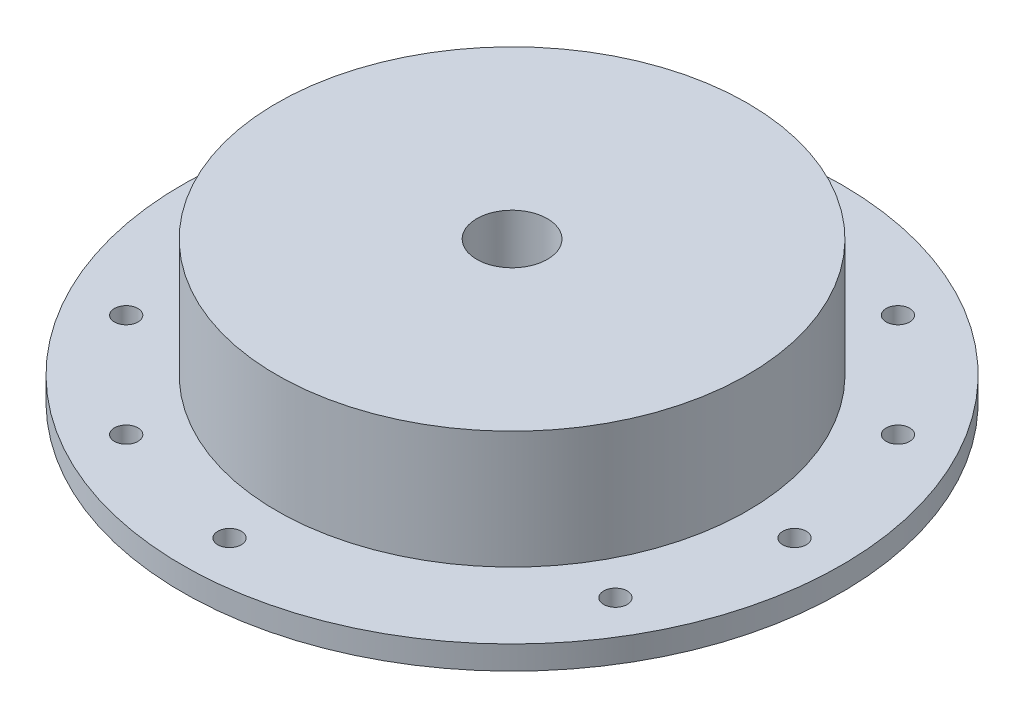
ISO-10303-21;
HEADER;
FILE_DESCRIPTION(('STEP AP214'),'2;1');
FILE_NAME('part.step','',(''),(''),'','','');
FILE_SCHEMA(('AUTOMOTIVE_DESIGN { 1 0 10303 214 1 1 1 1 }'));
ENDSEC;
DATA;
#1=APPLICATION_CONTEXT('core data for automotive mechanical design processes');
#2=APPLICATION_PROTOCOL_DEFINITION('international standard','automotive_design',2000,#1);
#3=PRODUCT_CONTEXT('',#1,'mechanical');
#4=PRODUCT('Part','Part','',(#3));
#5=PRODUCT_RELATED_PRODUCT_CATEGORY('part','',(#4));
#6=PRODUCT_DEFINITION_FORMATION('','',#4);
#7=PRODUCT_DEFINITION_CONTEXT('part definition',#1,'design');
#8=PRODUCT_DEFINITION('design','',#6,#7);
#9=PRODUCT_DEFINITION_SHAPE('','',#8);
#10=(LENGTH_UNIT() NAMED_UNIT(*) SI_UNIT(.MILLI.,.METRE.));
#11=(NAMED_UNIT(*) PLANE_ANGLE_UNIT() SI_UNIT($,.RADIAN.));
#12=(NAMED_UNIT(*) SI_UNIT($,.STERADIAN.) SOLID_ANGLE_UNIT());
#13=UNCERTAINTY_MEASURE_WITH_UNIT(LENGTH_MEASURE(1.E-05),#10,'distance_accuracy_value','');
#14=(GEOMETRIC_REPRESENTATION_CONTEXT(3) GLOBAL_UNCERTAINTY_ASSIGNED_CONTEXT((#13)) GLOBAL_UNIT_ASSIGNED_CONTEXT((#10,
#11,#12)) REPRESENTATION_CONTEXT('',''));
#15=CARTESIAN_POINT('',(0.,0.,0.));
#16=DIRECTION('',(0.,0.,1.));
#17=DIRECTION('',(1.,0.,0.));
#18=AXIS2_PLACEMENT_3D('',#15,#16,#17);
#19=CARTESIAN_POINT('',(63.5,38.1,0.));
#20=DIRECTION('',(0.,1.,0.));
#21=DIRECTION('',(0.,0.,1.));
#22=AXIS2_PLACEMENT_3D('',#19,#20,#21);
#23=PLANE('',#22);
#24=CARTESIAN_POINT('',(0.,38.1,0.));
#25=DIRECTION('',(0.,-1.,0.));
#26=DIRECTION('',(0.,0.,-1.));
#27=AXIS2_PLACEMENT_3D('',#24,#25,#26);
#28=CIRCLE('',#27,9.525);
#29=CARTESIAN_POINT('',(0.,38.1,-9.525));
#30=VERTEX_POINT('',#29);
#31=EDGE_CURVE('E10',#30,#30,#28,.T.);
#32=ORIENTED_EDGE('',*,*,#31,.T.);
#33=EDGE_LOOP('',(#32));
#34=FACE_BOUND('',#33,.T.);
#35=CARTESIAN_POINT('',(0.,38.1,0.));
#36=DIRECTION('',(0.,-1.,0.));
#37=DIRECTION('',(0.,0.,-1.));
#38=AXIS2_PLACEMENT_3D('',#35,#36,#37);
#39=CIRCLE('',#38,63.5);
#40=CARTESIAN_POINT('',(0.,38.1,-63.5));
#41=VERTEX_POINT('',#40);
#42=EDGE_CURVE('E58',#41,#41,#39,.T.);
#43=ORIENTED_EDGE('',*,*,#42,.F.);
#44=EDGE_LOOP('',(#43));
#45=FACE_BOUND('',#44,.T.);
#46=ADVANCED_FACE('F33',(#34,#45),#23,.T.);
#47=CARTESIAN_POINT('',(0.,0.,0.));
#48=DIRECTION('',(0.,-1.,0.));
#49=DIRECTION('',(0.,0.,-1.));
#50=AXIS2_PLACEMENT_3D('',#47,#48,#49);
#51=CYLINDRICAL_SURFACE('',#50,9.525);
#52=CARTESIAN_POINT('',(0.,11.1125,0.));
#53=DIRECTION('',(0.,-1.,0.));
#54=DIRECTION('',(0.,0.,-1.));
#55=AXIS2_PLACEMENT_3D('',#52,#53,#54);
#56=CIRCLE('',#55,9.525);
#57=CARTESIAN_POINT('',(0.,11.1125,-9.525));
#58=VERTEX_POINT('',#57);
#59=EDGE_CURVE('E39',#58,#58,#56,.T.);
#60=ORIENTED_EDGE('',*,*,#59,.T.);
#61=EDGE_LOOP('',(#60));
#62=FACE_BOUND('',#61,.T.);
#63=ORIENTED_EDGE('',*,*,#31,.F.);
#64=EDGE_LOOP('',(#63));
#65=FACE_BOUND('',#64,.T.);
#66=ADVANCED_FACE('F175',(#62,#65),#51,.F.);
#67=CARTESIAN_POINT('',(0.,42.2955357142857,0.));
#68=DIRECTION('',(0.,-1.,0.));
#69=DIRECTION('',(0.,0.,-1.));
#70=AXIS2_PLACEMENT_3D('',#67,#68,#69);
#71=DEGENERATE_TOROIDAL_SURFACE('',#70,38.1,42.2955357142857,.T.);
#72=CARTESIAN_POINT('',(0.,0.,0.));
#73=DIRECTION('',(0.,-1.,0.));
#74=DIRECTION('',(0.,0.,-1.));
#75=AXIS2_PLACEMENT_3D('',#72,#73,#74);
#76=CIRCLE('',#75,38.1);
#77=CARTESIAN_POINT('',(0.,0.,-38.1));
#78=VERTEX_POINT('',#77);
#79=EDGE_CURVE('E43',#78,#78,#76,.T.);
#80=ORIENTED_EDGE('',*,*,#79,.T.);
#81=EDGE_LOOP('',(#80));
#82=FACE_BOUND('',#81,.T.);
#83=ORIENTED_EDGE('',*,*,#59,.F.);
#84=EDGE_LOOP('',(#83));
#85=FACE_BOUND('',#84,.T.);
#86=ADVANCED_FACE('F168',(#82,#85),#71,.T.);
#87=CARTESIAN_POINT('',(38.1,0.,0.));
#88=DIRECTION('',(0.,-1.,0.));
#89=DIRECTION('',(0.,0.,-1.));
#90=AXIS2_PLACEMENT_3D('',#87,#88,#89);
#91=PLANE('',#90);
#92=CARTESIAN_POINT('',(-38.0999999999991,0.,65.9911357683747));
#93=DIRECTION('',(0.,1.,0.));
#94=DIRECTION('',(0.,0.,1.));
#95=AXIS2_PLACEMENT_3D('',#92,#93,#94);
#96=CIRCLE('',#95,3.175);
#97=CARTESIAN_POINT('',(-38.0999999999991,0.,69.1661357683747));
#98=VERTEX_POINT('',#97);
#99=EDGE_CURVE('E121',#98,#98,#96,.T.);
#100=ORIENTED_EDGE('',*,*,#99,.T.);
#101=EDGE_LOOP('',(#100));
#102=FACE_BOUND('',#101,.T.);
#103=CARTESIAN_POINT('',(-65.9911357683738,0.,38.1000000000008));
#104=DIRECTION('',(0.,1.,0.));
#105=DIRECTION('',(0.,0.,1.));
#106=AXIS2_PLACEMENT_3D('',#103,#104,#105);
#107=CIRCLE('',#106,3.175);
#108=CARTESIAN_POINT('',(-65.9911357683738,0.,41.2750000000008));
#109=VERTEX_POINT('',#108);
#110=EDGE_CURVE('E115',#109,#109,#107,.T.);
#111=ORIENTED_EDGE('',*,*,#110,.T.);
#112=EDGE_LOOP('',(#111));
#113=FACE_BOUND('',#112,.T.);
#114=CARTESIAN_POINT('',(-76.2,0.,8.08560974915401E-13));
#115=DIRECTION('',(0.,1.,0.));
#116=DIRECTION('',(0.,0.,1.));
#117=AXIS2_PLACEMENT_3D('',#114,#115,#116);
#118=CIRCLE('',#117,3.175);
#119=CARTESIAN_POINT('',(-76.2,0.,3.17500000000081));
#120=VERTEX_POINT('',#119);
#121=EDGE_CURVE('E109',#120,#120,#118,.T.);
#122=ORIENTED_EDGE('',*,*,#121,.T.);
#123=EDGE_LOOP('',(#122));
#124=FACE_BOUND('',#123,.T.);
#125=CARTESIAN_POINT('',(-65.9911357683746,0.,-38.0999999999994));
#126=DIRECTION('',(0.,1.,0.));
#127=DIRECTION('',(0.,0.,1.));
#128=AXIS2_PLACEMENT_3D('',#125,#126,#127);
#129=CIRCLE('',#128,3.175);
#130=CARTESIAN_POINT('',(-65.9911357683746,0.,-34.9249999999994));
#131=VERTEX_POINT('',#130);
#132=EDGE_CURVE('E103',#131,#131,#129,.T.);
#133=ORIENTED_EDGE('',*,*,#132,.T.);
#134=EDGE_LOOP('',(#133));
#135=FACE_BOUND('',#134,.T.);
#136=CARTESIAN_POINT('',(-38.1000000000005,0.,-65.9911357683739));
#137=DIRECTION('',(0.,1.,0.));
#138=DIRECTION('',(0.,0.,1.));
#139=AXIS2_PLACEMENT_3D('',#136,#137,#138);
#140=CIRCLE('',#139,3.175);
#141=CARTESIAN_POINT('',(-38.1000000000005,0.,-62.8161357683739));
#142=VERTEX_POINT('',#141);
#143=EDGE_CURVE('E97',#142,#142,#140,.T.);
#144=ORIENTED_EDGE('',*,*,#143,.T.);
#145=EDGE_LOOP('',(#144));
#146=FACE_BOUND('',#145,.T.);
#147=CARTESIAN_POINT('',(0.,0.,-76.2));
#148=DIRECTION('',(0.,1.,0.));
#149=DIRECTION('',(0.,0.,1.));
#150=AXIS2_PLACEMENT_3D('',#147,#148,#149);
#151=CIRCLE('',#150,3.175);
#152=CARTESIAN_POINT('',(0.,0.,-73.025));
#153=VERTEX_POINT('',#152);
#154=EDGE_CURVE('E91',#153,#153,#151,.T.);
#155=ORIENTED_EDGE('',*,*,#154,.T.);
#156=EDGE_LOOP('',(#155));
#157=FACE_BOUND('',#156,.T.);
#158=CARTESIAN_POINT('',(38.0999999999996,0.,-65.9911357683744));
#159=DIRECTION('',(0.,1.,0.));
#160=DIRECTION('',(0.,0.,1.));
#161=AXIS2_PLACEMENT_3D('',#158,#159,#160);
#162=CIRCLE('',#161,3.175);
#163=CARTESIAN_POINT('',(38.0999999999996,0.,-62.8161357683745));
#164=VERTEX_POINT('',#163);
#165=EDGE_CURVE('E85',#164,#164,#162,.T.);
#166=ORIENTED_EDGE('',*,*,#165,.T.);
#167=EDGE_LOOP('',(#166));
#168=FACE_BOUND('',#167,.T.);
#169=CARTESIAN_POINT('',(65.9911357683741,0.,-38.1000000000003));
#170=DIRECTION('',(0.,1.,0.));
#171=DIRECTION('',(0.,0.,1.));
#172=AXIS2_PLACEMENT_3D('',#169,#170,#171);
#173=CIRCLE('',#172,3.175);
#174=CARTESIAN_POINT('',(65.9911357683741,0.,-34.9250000000003));
#175=VERTEX_POINT('',#174);
#176=EDGE_CURVE('E79',#175,#175,#173,.T.);
#177=ORIENTED_EDGE('',*,*,#176,.T.);
#178=EDGE_LOOP('',(#177));
#179=FACE_BOUND('',#178,.T.);
#180=CARTESIAN_POINT('',(76.2,0.,-2.76459218875708E-13));
#181=DIRECTION('',(0.,1.,0.));
#182=DIRECTION('',(0.,0.,1.));
#183=AXIS2_PLACEMENT_3D('',#180,#181,#182);
#184=CIRCLE('',#183,3.175);
#185=CARTESIAN_POINT('',(76.2,0.,3.17499999999972));
#186=VERTEX_POINT('',#185);
#187=EDGE_CURVE('E73',#186,#186,#184,.T.);
#188=ORIENTED_EDGE('',*,*,#187,.T.);
#189=EDGE_LOOP('',(#188));
#190=FACE_BOUND('',#189,.T.);
#191=CARTESIAN_POINT('',(65.9911357683743,0.,38.0999999999998));
#192=DIRECTION('',(0.,1.,0.));
#193=DIRECTION('',(0.,0.,1.));
#194=AXIS2_PLACEMENT_3D('',#191,#192,#193);
#195=CIRCLE('',#194,3.175);
#196=CARTESIAN_POINT('',(65.9911357683743,0.,41.2749999999998));
#197=VERTEX_POINT('',#196);
#198=EDGE_CURVE('E67',#197,#197,#195,.T.);
#199=ORIENTED_EDGE('',*,*,#198,.T.);
#200=EDGE_LOOP('',(#199));
#201=FACE_BOUND('',#200,.T.);
#202=CARTESIAN_POINT('',(0.,0.,76.2));
#203=DIRECTION('',(0.,1.,0.));
#204=DIRECTION('',(0.,0.,1.));
#205=AXIS2_PLACEMENT_3D('',#202,#203,#204);
#206=CIRCLE('',#205,3.175);
#207=CARTESIAN_POINT('',(0.,0.,79.375));
#208=VERTEX_POINT('',#207);
#209=EDGE_CURVE('E61',#208,#208,#206,.T.);
#210=ORIENTED_EDGE('',*,*,#209,.T.);
#211=EDGE_LOOP('',(#210));
#212=FACE_BOUND('',#211,.T.);
#213=CARTESIAN_POINT('',(0.,0.,0.));
#214=DIRECTION('',(0.,-1.,0.));
#215=DIRECTION('',(0.,0.,-1.));
#216=AXIS2_PLACEMENT_3D('',#213,#214,#215);
#217=CIRCLE('',#216,88.9);
#218=CARTESIAN_POINT('',(0.,0.,-88.9));
#219=VERTEX_POINT('',#218);
#220=EDGE_CURVE('E47',#219,#219,#217,.T.);
#221=ORIENTED_EDGE('',*,*,#220,.T.);
#222=EDGE_LOOP('',(#221));
#223=FACE_BOUND('',#222,.T.);
#224=ORIENTED_EDGE('',*,*,#79,.F.);
#225=EDGE_LOOP('',(#224));
#226=FACE_BOUND('',#225,.T.);
#227=ADVANCED_FACE('F162',(#102,#113,#124,#135,#146,#157,#168,#179,#190,#201,#212,#223,#226),
#91,.T.);
#228=CARTESIAN_POINT('',(0.,0.,0.));
#229=DIRECTION('',(0.,-1.,0.));
#230=DIRECTION('',(0.,0.,-1.));
#231=AXIS2_PLACEMENT_3D('',#228,#229,#230);
#232=CYLINDRICAL_SURFACE('',#231,88.9);
#233=CARTESIAN_POINT('',(0.,6.35,0.));
#234=DIRECTION('',(0.,-1.,0.));
#235=DIRECTION('',(0.,0.,-1.));
#236=AXIS2_PLACEMENT_3D('',#233,#234,#235);
#237=CIRCLE('',#236,88.9);
#238=CARTESIAN_POINT('',(0.,6.35,-88.9));
#239=VERTEX_POINT('',#238);
#240=EDGE_CURVE('E52',#239,#239,#237,.T.);
#241=ORIENTED_EDGE('',*,*,#240,.T.);
#242=EDGE_LOOP('',(#241));
#243=FACE_BOUND('',#242,.T.);
#244=ORIENTED_EDGE('',*,*,#220,.F.);
#245=EDGE_LOOP('',(#244));
#246=FACE_BOUND('',#245,.T.);
#247=ADVANCED_FACE('F134',(#243,#246),#232,.T.);
#248=CARTESIAN_POINT('',(88.9,6.34999999999999,0.));
#249=DIRECTION('',(0.,1.,0.));
#250=DIRECTION('',(0.,0.,1.));
#251=AXIS2_PLACEMENT_3D('',#248,#249,#250);
#252=PLANE('',#251);
#253=CARTESIAN_POINT('',(-38.0999999999991,6.34999999999999,65.9911357683747));
#254=DIRECTION('',(0.,1.,0.));
#255=DIRECTION('',(0.,0.,1.));
#256=AXIS2_PLACEMENT_3D('',#253,#254,#255);
#257=CIRCLE('',#256,3.175);
#258=CARTESIAN_POINT('',(-38.0999999999991,6.34999999999999,69.1661357683747));
#259=VERTEX_POINT('',#258);
#260=EDGE_CURVE('E124',#259,#259,#257,.T.);
#261=ORIENTED_EDGE('',*,*,#260,.F.);
#262=EDGE_LOOP('',(#261));
#263=FACE_BOUND('',#262,.T.);
#264=CARTESIAN_POINT('',(-65.9911357683738,6.34999999999999,38.1000000000008));
#265=DIRECTION('',(0.,1.,0.));
#266=DIRECTION('',(0.,0.,1.));
#267=AXIS2_PLACEMENT_3D('',#264,#265,#266);
#268=CIRCLE('',#267,3.175);
#269=CARTESIAN_POINT('',(-65.9911357683738,6.34999999999999,41.2750000000008));
#270=VERTEX_POINT('',#269);
#271=EDGE_CURVE('E118',#270,#270,#268,.T.);
#272=ORIENTED_EDGE('',*,*,#271,.F.);
#273=EDGE_LOOP('',(#272));
#274=FACE_BOUND('',#273,.T.);
#275=CARTESIAN_POINT('',(-76.2,6.34999999999999,8.08560974915401E-13));
#276=DIRECTION('',(0.,1.,0.));
#277=DIRECTION('',(0.,0.,1.));
#278=AXIS2_PLACEMENT_3D('',#275,#276,#277);
#279=CIRCLE('',#278,3.175);
#280=CARTESIAN_POINT('',(-76.2,6.34999999999999,3.17500000000081));
#281=VERTEX_POINT('',#280);
#282=EDGE_CURVE('E112',#281,#281,#279,.T.);
#283=ORIENTED_EDGE('',*,*,#282,.F.);
#284=EDGE_LOOP('',(#283));
#285=FACE_BOUND('',#284,.T.);
#286=CARTESIAN_POINT('',(-65.9911357683746,6.34999999999999,-38.0999999999994));
#287=DIRECTION('',(0.,1.,0.));
#288=DIRECTION('',(0.,0.,1.));
#289=AXIS2_PLACEMENT_3D('',#286,#287,#288);
#290=CIRCLE('',#289,3.175);
#291=CARTESIAN_POINT('',(-65.9911357683746,6.34999999999999,-34.9249999999994));
#292=VERTEX_POINT('',#291);
#293=EDGE_CURVE('E106',#292,#292,#290,.T.);
#294=ORIENTED_EDGE('',*,*,#293,.F.);
#295=EDGE_LOOP('',(#294));
#296=FACE_BOUND('',#295,.T.);
#297=CARTESIAN_POINT('',(-38.1000000000005,6.34999999999999,-65.9911357683739));
#298=DIRECTION('',(0.,1.,0.));
#299=DIRECTION('',(0.,0.,1.));
#300=AXIS2_PLACEMENT_3D('',#297,#298,#299);
#301=CIRCLE('',#300,3.175);
#302=CARTESIAN_POINT('',(-38.1000000000005,6.34999999999999,-62.8161357683739));
#303=VERTEX_POINT('',#302);
#304=EDGE_CURVE('E100',#303,#303,#301,.T.);
#305=ORIENTED_EDGE('',*,*,#304,.F.);
#306=EDGE_LOOP('',(#305));
#307=FACE_BOUND('',#306,.T.);
#308=CARTESIAN_POINT('',(0.,6.34999999999999,-76.2));
#309=DIRECTION('',(0.,1.,0.));
#310=DIRECTION('',(0.,0.,1.));
#311=AXIS2_PLACEMENT_3D('',#308,#309,#310);
#312=CIRCLE('',#311,3.175);
#313=CARTESIAN_POINT('',(0.,6.34999999999999,-73.025));
#314=VERTEX_POINT('',#313);
#315=EDGE_CURVE('E94',#314,#314,#312,.T.);
#316=ORIENTED_EDGE('',*,*,#315,.F.);
#317=EDGE_LOOP('',(#316));
#318=FACE_BOUND('',#317,.T.);
#319=CARTESIAN_POINT('',(38.0999999999996,6.34999999999999,-65.9911357683744));
#320=DIRECTION('',(0.,1.,0.));
#321=DIRECTION('',(0.,0.,1.));
#322=AXIS2_PLACEMENT_3D('',#319,#320,#321);
#323=CIRCLE('',#322,3.175);
#324=CARTESIAN_POINT('',(38.0999999999996,6.34999999999999,-62.8161357683745));
#325=VERTEX_POINT('',#324);
#326=EDGE_CURVE('E88',#325,#325,#323,.T.);
#327=ORIENTED_EDGE('',*,*,#326,.F.);
#328=EDGE_LOOP('',(#327));
#329=FACE_BOUND('',#328,.T.);
#330=CARTESIAN_POINT('',(65.9911357683741,6.34999999999999,-38.1000000000003));
#331=DIRECTION('',(0.,1.,0.));
#332=DIRECTION('',(0.,0.,1.));
#333=AXIS2_PLACEMENT_3D('',#330,#331,#332);
#334=CIRCLE('',#333,3.175);
#335=CARTESIAN_POINT('',(65.9911357683741,6.34999999999999,-34.9250000000003));
#336=VERTEX_POINT('',#335);
#337=EDGE_CURVE('E82',#336,#336,#334,.T.);
#338=ORIENTED_EDGE('',*,*,#337,.F.);
#339=EDGE_LOOP('',(#338));
#340=FACE_BOUND('',#339,.T.);
#341=CARTESIAN_POINT('',(76.2,6.34999999999999,-2.76459218875708E-13));
#342=DIRECTION('',(0.,1.,0.));
#343=DIRECTION('',(0.,0.,1.));
#344=AXIS2_PLACEMENT_3D('',#341,#342,#343);
#345=CIRCLE('',#344,3.175);
#346=CARTESIAN_POINT('',(76.2,6.34999999999999,3.17499999999972));
#347=VERTEX_POINT('',#346);
#348=EDGE_CURVE('E76',#347,#347,#345,.T.);
#349=ORIENTED_EDGE('',*,*,#348,.F.);
#350=EDGE_LOOP('',(#349));
#351=FACE_BOUND('',#350,.T.);
#352=CARTESIAN_POINT('',(65.9911357683743,6.34999999999999,38.0999999999998));
#353=DIRECTION('',(0.,1.,0.));
#354=DIRECTION('',(0.,0.,1.));
#355=AXIS2_PLACEMENT_3D('',#352,#353,#354);
#356=CIRCLE('',#355,3.175);
#357=CARTESIAN_POINT('',(65.9911357683743,6.34999999999999,41.2749999999998));
#358=VERTEX_POINT('',#357);
#359=EDGE_CURVE('E70',#358,#358,#356,.T.);
#360=ORIENTED_EDGE('',*,*,#359,.F.);
#361=EDGE_LOOP('',(#360));
#362=FACE_BOUND('',#361,.T.);
#363=CARTESIAN_POINT('',(0.,6.34999999999999,76.2));
#364=DIRECTION('',(0.,1.,0.));
#365=DIRECTION('',(0.,0.,1.));
#366=AXIS2_PLACEMENT_3D('',#363,#364,#365);
#367=CIRCLE('',#366,3.175);
#368=CARTESIAN_POINT('',(0.,6.34999999999999,79.375));
#369=VERTEX_POINT('',#368);
#370=EDGE_CURVE('E64',#369,#369,#367,.T.);
#371=ORIENTED_EDGE('',*,*,#370,.F.);
#372=EDGE_LOOP('',(#371));
#373=FACE_BOUND('',#372,.T.);
#374=CARTESIAN_POINT('',(0.,6.34999999999999,0.));
#375=DIRECTION('',(0.,-1.,0.));
#376=DIRECTION('',(0.,0.,-1.));
#377=AXIS2_PLACEMENT_3D('',#374,#375,#376);
#378=CIRCLE('',#377,63.5);
#379=CARTESIAN_POINT('',(0.,6.34999999999999,-63.5));
#380=VERTEX_POINT('',#379);
#381=EDGE_CURVE('E55',#380,#380,#378,.T.);
#382=ORIENTED_EDGE('',*,*,#381,.T.);
#383=EDGE_LOOP('',(#382));
#384=FACE_BOUND('',#383,.T.);
#385=ORIENTED_EDGE('',*,*,#240,.F.);
#386=EDGE_LOOP('',(#385));
#387=FACE_BOUND('',#386,.T.);
#388=ADVANCED_FACE('F130',(#263,#274,#285,#296,#307,#318,#329,#340,#351,#362,#373,#384,#387),
#252,.T.);
#389=CARTESIAN_POINT('',(0.,0.,0.));
#390=DIRECTION('',(0.,-1.,0.));
#391=DIRECTION('',(0.,0.,-1.));
#392=AXIS2_PLACEMENT_3D('',#389,#390,#391);
#393=CYLINDRICAL_SURFACE('',#392,63.5);
#394=ORIENTED_EDGE('',*,*,#42,.T.);
#395=EDGE_LOOP('',(#394));
#396=FACE_BOUND('',#395,.T.);
#397=ORIENTED_EDGE('',*,*,#381,.F.);
#398=EDGE_LOOP('',(#397));
#399=FACE_BOUND('',#398,.T.);
#400=ADVANCED_FACE('F133',(#396,#399),#393,.T.);
#401=CARTESIAN_POINT('',(0.,6.34999999999999,76.2));
#402=DIRECTION('',(0.,1.,0.));
#403=DIRECTION('',(0.,0.,1.));
#404=AXIS2_PLACEMENT_3D('',#401,#402,#403);
#405=CYLINDRICAL_SURFACE('',#404,3.175);
#406=ORIENTED_EDGE('',*,*,#209,.F.);
#407=EDGE_LOOP('',(#406));
#408=FACE_BOUND('',#407,.T.);
#409=ORIENTED_EDGE('',*,*,#370,.T.);
#410=EDGE_LOOP('',(#409));
#411=FACE_BOUND('',#410,.T.);
#412=ADVANCED_FACE('F188',(#408,#411),#405,.F.);
#413=CARTESIAN_POINT('',(65.9911357683743,6.34999999999999,38.0999999999998));
#414=DIRECTION('',(0.,1.,0.));
#415=DIRECTION('',(0.,0.,1.));
#416=AXIS2_PLACEMENT_3D('',#413,#414,#415);
#417=CYLINDRICAL_SURFACE('',#416,3.175);
#418=ORIENTED_EDGE('',*,*,#198,.F.);
#419=EDGE_LOOP('',(#418));
#420=FACE_BOUND('',#419,.T.);
#421=ORIENTED_EDGE('',*,*,#359,.T.);
#422=EDGE_LOOP('',(#421));
#423=FACE_BOUND('',#422,.T.);
#424=ADVANCED_FACE('F193',(#420,#423),#417,.F.);
#425=CARTESIAN_POINT('',(76.2,6.34999999999999,-2.76459218875708E-13));
#426=DIRECTION('',(0.,1.,0.));
#427=DIRECTION('',(0.,0.,1.));
#428=AXIS2_PLACEMENT_3D('',#425,#426,#427);
#429=CYLINDRICAL_SURFACE('',#428,3.175);
#430=ORIENTED_EDGE('',*,*,#187,.F.);
#431=EDGE_LOOP('',(#430));
#432=FACE_BOUND('',#431,.T.);
#433=ORIENTED_EDGE('',*,*,#348,.T.);
#434=EDGE_LOOP('',(#433));
#435=FACE_BOUND('',#434,.T.);
#436=ADVANCED_FACE('F199',(#432,#435),#429,.F.);
#437=CARTESIAN_POINT('',(65.9911357683741,6.34999999999999,-38.1000000000003));
#438=DIRECTION('',(0.,1.,0.));
#439=DIRECTION('',(0.,0.,1.));
#440=AXIS2_PLACEMENT_3D('',#437,#438,#439);
#441=CYLINDRICAL_SURFACE('',#440,3.175);
#442=ORIENTED_EDGE('',*,*,#176,.F.);
#443=EDGE_LOOP('',(#442));
#444=FACE_BOUND('',#443,.T.);
#445=ORIENTED_EDGE('',*,*,#337,.T.);
#446=EDGE_LOOP('',(#445));
#447=FACE_BOUND('',#446,.T.);
#448=ADVANCED_FACE('F203',(#444,#447),#441,.F.);
#449=CARTESIAN_POINT('',(38.0999999999996,6.34999999999999,-65.9911357683744));
#450=DIRECTION('',(0.,1.,0.));
#451=DIRECTION('',(0.,0.,1.));
#452=AXIS2_PLACEMENT_3D('',#449,#450,#451);
#453=CYLINDRICAL_SURFACE('',#452,3.175);
#454=ORIENTED_EDGE('',*,*,#165,.F.);
#455=EDGE_LOOP('',(#454));
#456=FACE_BOUND('',#455,.T.);
#457=ORIENTED_EDGE('',*,*,#326,.T.);
#458=EDGE_LOOP('',(#457));
#459=FACE_BOUND('',#458,.T.);
#460=ADVANCED_FACE('F207',(#456,#459),#453,.F.);
#461=CARTESIAN_POINT('',(0.,6.34999999999999,-76.2));
#462=DIRECTION('',(0.,1.,0.));
#463=DIRECTION('',(0.,0.,1.));
#464=AXIS2_PLACEMENT_3D('',#461,#462,#463);
#465=CYLINDRICAL_SURFACE('',#464,3.175);
#466=ORIENTED_EDGE('',*,*,#154,.F.);
#467=EDGE_LOOP('',(#466));
#468=FACE_BOUND('',#467,.T.);
#469=ORIENTED_EDGE('',*,*,#315,.T.);
#470=EDGE_LOOP('',(#469));
#471=FACE_BOUND('',#470,.T.);
#472=ADVANCED_FACE('F211',(#468,#471),#465,.F.);
#473=CARTESIAN_POINT('',(-38.1000000000005,6.34999999999999,-65.9911357683739));
#474=DIRECTION('',(0.,1.,0.));
#475=DIRECTION('',(0.,0.,1.));
#476=AXIS2_PLACEMENT_3D('',#473,#474,#475);
#477=CYLINDRICAL_SURFACE('',#476,3.175);
#478=ORIENTED_EDGE('',*,*,#143,.F.);
#479=EDGE_LOOP('',(#478));
#480=FACE_BOUND('',#479,.T.);
#481=ORIENTED_EDGE('',*,*,#304,.T.);
#482=EDGE_LOOP('',(#481));
#483=FACE_BOUND('',#482,.T.);
#484=ADVANCED_FACE('F215',(#480,#483),#477,.F.);
#485=CARTESIAN_POINT('',(-65.9911357683746,6.34999999999999,-38.0999999999994));
#486=DIRECTION('',(0.,1.,0.));
#487=DIRECTION('',(0.,0.,1.));
#488=AXIS2_PLACEMENT_3D('',#485,#486,#487);
#489=CYLINDRICAL_SURFACE('',#488,3.175);
#490=ORIENTED_EDGE('',*,*,#132,.F.);
#491=EDGE_LOOP('',(#490));
#492=FACE_BOUND('',#491,.T.);
#493=ORIENTED_EDGE('',*,*,#293,.T.);
#494=EDGE_LOOP('',(#493));
#495=FACE_BOUND('',#494,.T.);
#496=ADVANCED_FACE('F219',(#492,#495),#489,.F.);
#497=CARTESIAN_POINT('',(-76.2,6.34999999999999,8.08560974915401E-13));
#498=DIRECTION('',(0.,1.,0.));
#499=DIRECTION('',(0.,0.,1.));
#500=AXIS2_PLACEMENT_3D('',#497,#498,#499);
#501=CYLINDRICAL_SURFACE('',#500,3.175);
#502=ORIENTED_EDGE('',*,*,#121,.F.);
#503=EDGE_LOOP('',(#502));
#504=FACE_BOUND('',#503,.T.);
#505=ORIENTED_EDGE('',*,*,#282,.T.);
#506=EDGE_LOOP('',(#505));
#507=FACE_BOUND('',#506,.T.);
#508=ADVANCED_FACE('F223',(#504,#507),#501,.F.);
#509=CARTESIAN_POINT('',(-65.9911357683738,6.34999999999999,38.1000000000008));
#510=DIRECTION('',(0.,1.,0.));
#511=DIRECTION('',(0.,0.,1.));
#512=AXIS2_PLACEMENT_3D('',#509,#510,#511);
#513=CYLINDRICAL_SURFACE('',#512,3.175);
#514=ORIENTED_EDGE('',*,*,#110,.F.);
#515=EDGE_LOOP('',(#514));
#516=FACE_BOUND('',#515,.T.);
#517=ORIENTED_EDGE('',*,*,#271,.T.);
#518=EDGE_LOOP('',(#517));
#519=FACE_BOUND('',#518,.T.);
#520=ADVANCED_FACE('F227',(#516,#519),#513,.F.);
#521=CARTESIAN_POINT('',(-38.0999999999991,6.34999999999999,65.9911357683747));
#522=DIRECTION('',(0.,1.,0.));
#523=DIRECTION('',(0.,0.,1.));
#524=AXIS2_PLACEMENT_3D('',#521,#522,#523);
#525=CYLINDRICAL_SURFACE('',#524,3.175);
#526=ORIENTED_EDGE('',*,*,#99,.F.);
#527=EDGE_LOOP('',(#526));
#528=FACE_BOUND('',#527,.T.);
#529=ORIENTED_EDGE('',*,*,#260,.T.);
#530=EDGE_LOOP('',(#529));
#531=FACE_BOUND('',#530,.T.);
#532=ADVANCED_FACE('F128',(#528,#531),#525,.F.);
#533=CLOSED_SHELL('',(#46,#66,#86,#227,#247,#388,#400,#412,#424,#436,#448,#460,#472,#484,#496,
#508,#520,#532));
#534=MANIFOLD_SOLID_BREP('B2',#533);
#535=ADVANCED_BREP_SHAPE_REPRESENTATION('',(#18,#534),#14);
#536=SHAPE_DEFINITION_REPRESENTATION(#9,#535);
ENDSEC;
END-ISO-10303-21;
